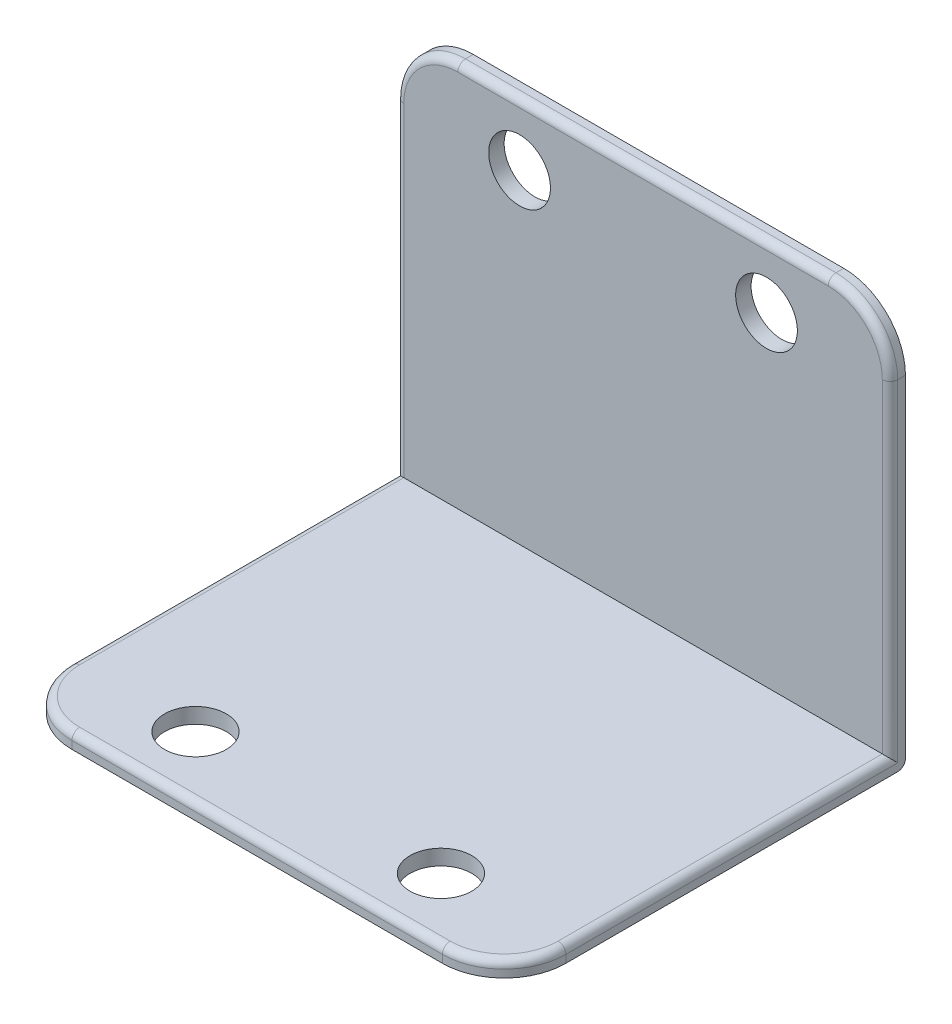
ISO-10303-21;
HEADER;
FILE_DESCRIPTION(('STEP AP214'),'2;1');
FILE_NAME('part.step','',(''),(''),'','','');
FILE_SCHEMA(('AUTOMOTIVE_DESIGN { 1 0 10303 214 1 1 1 1 }'));
ENDSEC;
DATA;
#1=APPLICATION_CONTEXT('core data for automotive mechanical design processes');
#2=APPLICATION_PROTOCOL_DEFINITION('international standard','automotive_design',2000,#1);
#3=PRODUCT_CONTEXT('',#1,'mechanical');
#4=PRODUCT('Part','Part','',(#3));
#5=PRODUCT_RELATED_PRODUCT_CATEGORY('part','',(#4));
#6=PRODUCT_DEFINITION_FORMATION('','',#4);
#7=PRODUCT_DEFINITION_CONTEXT('part definition',#1,'design');
#8=PRODUCT_DEFINITION('design','',#6,#7);
#9=PRODUCT_DEFINITION_SHAPE('','',#8);
#10=(LENGTH_UNIT() NAMED_UNIT(*) SI_UNIT(.MILLI.,.METRE.));
#11=(NAMED_UNIT(*) PLANE_ANGLE_UNIT() SI_UNIT($,.RADIAN.));
#12=(NAMED_UNIT(*) SI_UNIT($,.STERADIAN.) SOLID_ANGLE_UNIT());
#13=UNCERTAINTY_MEASURE_WITH_UNIT(LENGTH_MEASURE(1.E-05),#10,'distance_accuracy_value','');
#14=(GEOMETRIC_REPRESENTATION_CONTEXT(3) GLOBAL_UNCERTAINTY_ASSIGNED_CONTEXT((#13)) GLOBAL_UNIT_ASSIGNED_CONTEXT((#10,
#11,#12)) REPRESENTATION_CONTEXT('',''));
#15=CARTESIAN_POINT('',(0.,0.,0.));
#16=DIRECTION('',(0.,0.,1.));
#17=DIRECTION('',(1.,0.,0.));
#18=AXIS2_PLACEMENT_3D('',#15,#16,#17);
#19=CARTESIAN_POINT('',(0.,1.,0.));
#20=DIRECTION('',(0.,-1.,0.));
#21=DIRECTION('',(0.,0.,-1.));
#22=AXIS2_PLACEMENT_3D('',#19,#20,#21);
#23=PLANE('',#22);
#24=CARTESIAN_POINT('',(7.90530336490949,1.,9.));
#25=DIRECTION('',(0.,1.,0.));
#26=DIRECTION('',(0.,0.,1.));
#27=AXIS2_PLACEMENT_3D('',#24,#25,#26);
#28=CIRCLE('',#27,2.);
#29=CARTESIAN_POINT('',(7.90530336490949,1.,11.));
#30=VERTEX_POINT('',#29);
#31=EDGE_CURVE('E418',#30,#30,#28,.T.);
#32=ORIENTED_EDGE('',*,*,#31,.F.);
#33=EDGE_LOOP('',(#32));
#34=FACE_BOUND('',#33,.T.);
#35=CARTESIAN_POINT('',(-8.,1.,9.));
#36=DIRECTION('',(0.,1.,0.));
#37=DIRECTION('',(0.,0.,1.));
#38=AXIS2_PLACEMENT_3D('',#35,#36,#37);
#39=CIRCLE('',#38,2.);
#40=CARTESIAN_POINT('',(-8.,1.,11.));
#41=VERTEX_POINT('',#40);
#42=EDGE_CURVE('E427',#41,#41,#39,.T.);
#43=ORIENTED_EDGE('',*,*,#42,.F.);
#44=EDGE_LOOP('',(#43));
#45=FACE_BOUND('',#44,.T.);
#46=CARTESIAN_POINT('',(12.,1.,9.));
#47=DIRECTION('',(0.,-1.,0.));
#48=DIRECTION('',(0.,0.,-1.));
#49=AXIS2_PLACEMENT_3D('',#46,#47,#48);
#50=CIRCLE('',#49,3.5);
#51=CARTESIAN_POINT('',(12.,1.,12.5));
#52=VERTEX_POINT('',#51);
#53=CARTESIAN_POINT('',(15.5,1.,9.));
#54=VERTEX_POINT('',#53);
#55=EDGE_CURVE('E285',#52,#54,#50,.F.);
#56=ORIENTED_EDGE('',*,*,#55,.T.);
#57=DIRECTION('',(0.,0.,-1.));
#58=VECTOR('',#57,1.);
#59=CARTESIAN_POINT('',(15.5,1.,0.));
#60=LINE('',#59,#58);
#61=CARTESIAN_POINT('',(15.5,1.,-12.));
#62=VERTEX_POINT('',#61);
#63=EDGE_CURVE('E288',#54,#62,#60,.T.);
#64=ORIENTED_EDGE('',*,*,#63,.T.);
#65=DIRECTION('',(1.,0.,0.));
#66=VECTOR('',#65,1.);
#67=CARTESIAN_POINT('',(-16.,1.,-12.));
#68=LINE('',#67,#66);
#69=CARTESIAN_POINT('',(-15.5,1.,-12.));
#70=VERTEX_POINT('',#69);
#71=EDGE_CURVE('E362',#70,#62,#68,.T.);
#72=ORIENTED_EDGE('',*,*,#71,.F.);
#73=DIRECTION('',(0.,0.,1.));
#74=VECTOR('',#73,1.);
#75=CARTESIAN_POINT('',(-15.5,1.,0.));
#76=LINE('',#75,#74);
#77=CARTESIAN_POINT('',(-15.5,1.,9.));
#78=VERTEX_POINT('',#77);
#79=EDGE_CURVE('E258',#70,#78,#76,.T.);
#80=ORIENTED_EDGE('',*,*,#79,.T.);
#81=CARTESIAN_POINT('',(-12.,1.,9.));
#82=DIRECTION('',(0.,-1.,0.));
#83=DIRECTION('',(0.,0.,-1.));
#84=AXIS2_PLACEMENT_3D('',#81,#82,#83);
#85=CIRCLE('',#84,3.5);
#86=CARTESIAN_POINT('',(-12.,1.,12.5));
#87=VERTEX_POINT('',#86);
#88=EDGE_CURVE('E279',#78,#87,#85,.F.);
#89=ORIENTED_EDGE('',*,*,#88,.T.);
#90=DIRECTION('',(1.,0.,0.));
#91=VECTOR('',#90,1.);
#92=CARTESIAN_POINT('',(0.,1.,12.5));
#93=LINE('',#92,#91);
#94=EDGE_CURVE('E282',#87,#52,#93,.T.);
#95=ORIENTED_EDGE('',*,*,#94,.T.);
#96=EDGE_LOOP('',(#56,#64,#72,#80,#89,#95));
#97=FACE_BOUND('',#96,.T.);
#98=ADVANCED_FACE('F44',(#34,#45,#97),#23,.F.);
#99=CARTESIAN_POINT('',(0.,0.,0.));
#100=DIRECTION('',(0.,-1.,0.));
#101=DIRECTION('',(0.,0.,-1.));
#102=AXIS2_PLACEMENT_3D('',#99,#100,#101);
#103=PLANE('',#102);
#104=CARTESIAN_POINT('',(-8.,0.,9.));
#105=DIRECTION('',(0.,1.,0.));
#106=DIRECTION('',(0.,0.,1.));
#107=AXIS2_PLACEMENT_3D('',#104,#105,#106);
#108=CIRCLE('',#107,2.);
#109=CARTESIAN_POINT('',(-8.,0.,11.));
#110=VERTEX_POINT('',#109);
#111=EDGE_CURVE('E425',#110,#110,#108,.T.);
#112=ORIENTED_EDGE('',*,*,#111,.T.);
#113=EDGE_LOOP('',(#112));
#114=FACE_BOUND('',#113,.T.);
#115=DIRECTION('',(0.,0.,1.));
#116=VECTOR('',#115,1.);
#117=CARTESIAN_POINT('',(-16.,0.,13.));
#118=LINE('',#117,#116);
#119=CARTESIAN_POINT('',(-16.,0.,-12.5));
#120=VERTEX_POINT('',#119);
#121=CARTESIAN_POINT('',(-16.,0.,9.));
#122=VERTEX_POINT('',#121);
#123=EDGE_CURVE('E185',#120,#122,#118,.T.);
#124=ORIENTED_EDGE('',*,*,#123,.F.);
#125=DIRECTION('',(-1.,0.,0.));
#126=VECTOR('',#125,1.);
#127=CARTESIAN_POINT('',(16.,0.,-12.5));
#128=LINE('',#127,#126);
#129=CARTESIAN_POINT('',(16.,0.,-12.5));
#130=VERTEX_POINT('',#129);
#131=EDGE_CURVE('E53',#120,#130,#128,.F.);
#132=ORIENTED_EDGE('',*,*,#131,.T.);
#133=DIRECTION('',(0.,0.,-1.));
#134=VECTOR('',#133,1.);
#135=CARTESIAN_POINT('',(16.,0.,13.));
#136=LINE('',#135,#134);
#137=CARTESIAN_POINT('',(16.,0.,9.));
#138=VERTEX_POINT('',#137);
#139=EDGE_CURVE('E190',#138,#130,#136,.T.);
#140=ORIENTED_EDGE('',*,*,#139,.F.);
#141=CARTESIAN_POINT('',(12.,0.,9.));
#142=DIRECTION('',(0.,-1.,0.));
#143=DIRECTION('',(0.,0.,-1.));
#144=AXIS2_PLACEMENT_3D('',#141,#142,#143);
#145=CIRCLE('',#144,4.);
#146=CARTESIAN_POINT('',(12.,0.,13.));
#147=VERTEX_POINT('',#146);
#148=EDGE_CURVE('E182',#138,#147,#145,.T.);
#149=ORIENTED_EDGE('',*,*,#148,.T.);
#150=DIRECTION('',(1.,0.,0.));
#151=VECTOR('',#150,1.);
#152=CARTESIAN_POINT('',(-16.,0.,13.));
#153=LINE('',#152,#151);
#154=CARTESIAN_POINT('',(-12.,0.,13.));
#155=VERTEX_POINT('',#154);
#156=EDGE_CURVE('E162',#155,#147,#153,.T.);
#157=ORIENTED_EDGE('',*,*,#156,.F.);
#158=CARTESIAN_POINT('',(-12.,0.,9.));
#159=DIRECTION('',(0.,-1.,0.));
#160=DIRECTION('',(0.,0.,-1.));
#161=AXIS2_PLACEMENT_3D('',#158,#159,#160);
#162=CIRCLE('',#161,4.);
#163=EDGE_CURVE('E169',#155,#122,#162,.T.);
#164=ORIENTED_EDGE('',*,*,#163,.T.);
#165=EDGE_LOOP('',(#124,#132,#140,#149,#157,#164));
#166=FACE_BOUND('',#165,.T.);
#167=CARTESIAN_POINT('',(7.90530336490949,0.,9.));
#168=DIRECTION('',(0.,1.,0.));
#169=DIRECTION('',(0.,0.,1.));
#170=AXIS2_PLACEMENT_3D('',#167,#168,#169);
#171=CIRCLE('',#170,2.);
#172=CARTESIAN_POINT('',(7.90530336490949,0.,11.));
#173=VERTEX_POINT('',#172);
#174=EDGE_CURVE('E414',#173,#173,#171,.T.);
#175=ORIENTED_EDGE('',*,*,#174,.T.);
#176=EDGE_LOOP('',(#175));
#177=FACE_BOUND('',#176,.T.);
#178=ADVANCED_FACE('F179',(#114,#166,#177),#103,.T.);
#179=CARTESIAN_POINT('',(16.,1.,13.));
#180=DIRECTION('',(-1.,0.,0.));
#181=DIRECTION('',(0.,0.,1.));
#182=AXIS2_PLACEMENT_3D('',#179,#180,#181);
#183=PLANE('',#182);
#184=ORIENTED_EDGE('',*,*,#139,.T.);
#185=CARTESIAN_POINT('',(16.,0.5,-12.5));
#186=DIRECTION('',(-1.,0.,0.));
#187=DIRECTION('',(0.,0.,1.));
#188=AXIS2_PLACEMENT_3D('',#185,#186,#187);
#189=CIRCLE('',#188,0.5);
#190=CARTESIAN_POINT('',(16.,0.5,-13.));
#191=VERTEX_POINT('',#190);
#192=EDGE_CURVE('E11',#130,#191,#189,.F.);
#193=ORIENTED_EDGE('',*,*,#192,.T.);
#194=DIRECTION('',(0.,-1.,0.));
#195=VECTOR('',#194,1.);
#196=CARTESIAN_POINT('',(16.,1.,-13.));
#197=LINE('',#196,#195);
#198=CARTESIAN_POINT('',(16.,22.,-13.));
#199=VERTEX_POINT('',#198);
#200=EDGE_CURVE('E170',#199,#191,#197,.T.);
#201=ORIENTED_EDGE('',*,*,#200,.F.);
#202=DIRECTION('',(0.,0.,-1.));
#203=VECTOR('',#202,1.);
#204=CARTESIAN_POINT('',(16.,22.,-12.));
#205=LINE('',#204,#203);
#206=CARTESIAN_POINT('',(16.,22.,-12.5));
#207=VERTEX_POINT('',#206);
#208=EDGE_CURVE('E213',#199,#207,#205,.F.);
#209=ORIENTED_EDGE('',*,*,#208,.T.);
#210=DIRECTION('',(0.,-1.,0.));
#211=VECTOR('',#210,1.);
#212=CARTESIAN_POINT('',(16.,1.,-12.5));
#213=LINE('',#212,#211);
#214=CARTESIAN_POINT('',(16.,0.5,-12.5));
#215=VERTEX_POINT('',#214);
#216=EDGE_CURVE('E255',#207,#215,#213,.T.);
#217=ORIENTED_EDGE('',*,*,#216,.T.);
#218=DIRECTION('',(0.,0.,-1.));
#219=VECTOR('',#218,1.);
#220=CARTESIAN_POINT('',(16.,0.5,13.));
#221=LINE('',#220,#219);
#222=CARTESIAN_POINT('',(16.,0.5,9.));
#223=VERTEX_POINT('',#222);
#224=EDGE_CURVE('E292',#215,#223,#221,.F.);
#225=ORIENTED_EDGE('',*,*,#224,.T.);
#226=DIRECTION('',(0.,-1.,0.));
#227=VECTOR('',#226,1.);
#228=CARTESIAN_POINT('',(16.,1.,9.));
#229=LINE('',#228,#227);
#230=EDGE_CURVE('E199',#223,#138,#229,.T.);
#231=ORIENTED_EDGE('',*,*,#230,.T.);
#232=EDGE_LOOP('',(#184,#193,#201,#209,#217,#225,#231));
#233=FACE_BOUND('',#232,.T.);
#234=ADVANCED_FACE('F435',(#233),#183,.F.);
#235=CARTESIAN_POINT('',(-16.,1.,-13.));
#236=DIRECTION('',(0.,0.,1.));
#237=DIRECTION('',(1.,0.,0.));
#238=AXIS2_PLACEMENT_3D('',#235,#236,#237);
#239=PLANE('',#238);
#240=CARTESIAN_POINT('',(8.,22.,-13.));
#241=DIRECTION('',(0.,0.,1.));
#242=DIRECTION('',(1.,0.,0.));
#243=AXIS2_PLACEMENT_3D('',#240,#241,#242);
#244=CIRCLE('',#243,2.);
#245=CARTESIAN_POINT('',(10.,22.,-13.));
#246=VERTEX_POINT('',#245);
#247=EDGE_CURVE('E370',#246,#246,#244,.T.);
#248=ORIENTED_EDGE('',*,*,#247,.T.);
#249=EDGE_LOOP('',(#248));
#250=FACE_BOUND('',#249,.T.);
#251=CARTESIAN_POINT('',(-8.,22.,-13.));
#252=DIRECTION('',(0.,0.,1.));
#253=DIRECTION('',(1.,0.,0.));
#254=AXIS2_PLACEMENT_3D('',#251,#252,#253);
#255=CIRCLE('',#254,2.);
#256=CARTESIAN_POINT('',(-6.,22.,-13.));
#257=VERTEX_POINT('',#256);
#258=EDGE_CURVE('E276',#257,#257,#255,.T.);
#259=ORIENTED_EDGE('',*,*,#258,.T.);
#260=EDGE_LOOP('',(#259));
#261=FACE_BOUND('',#260,.T.);
#262=ORIENTED_EDGE('',*,*,#200,.T.);
#263=DIRECTION('',(-1.,0.,0.));
#264=VECTOR('',#263,1.);
#265=CARTESIAN_POINT('',(-16.,0.5,-13.));
#266=LINE('',#265,#264);
#267=CARTESIAN_POINT('',(-16.,0.5,-13.));
#268=VERTEX_POINT('',#267);
#269=EDGE_CURVE('E314',#191,#268,#266,.T.);
#270=ORIENTED_EDGE('',*,*,#269,.T.);
#271=DIRECTION('',(0.,-1.,0.));
#272=VECTOR('',#271,1.);
#273=CARTESIAN_POINT('',(-16.,1.,-13.));
#274=LINE('',#273,#272);
#275=CARTESIAN_POINT('',(-16.,22.,-13.));
#276=VERTEX_POINT('',#275);
#277=EDGE_CURVE('E184',#276,#268,#274,.T.);
#278=ORIENTED_EDGE('',*,*,#277,.F.);
#279=CARTESIAN_POINT('',(-12.,22.,-13.));
#280=DIRECTION('',(0.,0.,1.));
#281=DIRECTION('',(1.,0.,0.));
#282=AXIS2_PLACEMENT_3D('',#279,#280,#281);
#283=CIRCLE('',#282,4.);
#284=CARTESIAN_POINT('',(-12.,26.,-13.));
#285=VERTEX_POINT('',#284);
#286=EDGE_CURVE('E224',#276,#285,#283,.F.);
#287=ORIENTED_EDGE('',*,*,#286,.T.);
#288=DIRECTION('',(-1.,0.,0.));
#289=VECTOR('',#288,1.);
#290=CARTESIAN_POINT('',(-16.,26.,-13.));
#291=LINE('',#290,#289);
#292=CARTESIAN_POINT('',(12.,26.,-13.));
#293=VERTEX_POINT('',#292);
#294=EDGE_CURVE('E369',#293,#285,#291,.T.);
#295=ORIENTED_EDGE('',*,*,#294,.F.);
#296=CARTESIAN_POINT('',(12.,22.,-13.));
#297=DIRECTION('',(0.,0.,1.));
#298=DIRECTION('',(1.,0.,0.));
#299=AXIS2_PLACEMENT_3D('',#296,#297,#298);
#300=CIRCLE('',#299,4.);
#301=EDGE_CURVE('E210',#293,#199,#300,.F.);
#302=ORIENTED_EDGE('',*,*,#301,.T.);
#303=EDGE_LOOP('',(#262,#270,#278,#287,#295,#302));
#304=FACE_BOUND('',#303,.T.);
#305=ADVANCED_FACE('F338',(#250,#261,#304),#239,.F.);
#306=CARTESIAN_POINT('',(-16.,1.,13.));
#307=DIRECTION('',(1.,0.,0.));
#308=DIRECTION('',(0.,0.,-1.));
#309=AXIS2_PLACEMENT_3D('',#306,#307,#308);
#310=PLANE('',#309);
#311=ORIENTED_EDGE('',*,*,#277,.T.);
#312=CARTESIAN_POINT('',(-16.,0.5,-12.5));
#313=DIRECTION('',(1.,0.,0.));
#314=DIRECTION('',(0.,0.,-1.));
#315=AXIS2_PLACEMENT_3D('',#312,#313,#314);
#316=CIRCLE('',#315,0.5);
#317=EDGE_CURVE('E67',#268,#120,#316,.F.);
#318=ORIENTED_EDGE('',*,*,#317,.T.);
#319=ORIENTED_EDGE('',*,*,#123,.T.);
#320=DIRECTION('',(0.,-1.,0.));
#321=VECTOR('',#320,1.);
#322=CARTESIAN_POINT('',(-16.,1.,9.));
#323=LINE('',#322,#321);
#324=CARTESIAN_POINT('',(-16.,0.5,9.));
#325=VERTEX_POINT('',#324);
#326=EDGE_CURVE('E176',#122,#325,#323,.F.);
#327=ORIENTED_EDGE('',*,*,#326,.T.);
#328=DIRECTION('',(0.,0.,1.));
#329=VECTOR('',#328,1.);
#330=CARTESIAN_POINT('',(-16.,0.5,13.));
#331=LINE('',#330,#329);
#332=CARTESIAN_POINT('',(-16.,0.5,-12.5));
#333=VERTEX_POINT('',#332);
#334=EDGE_CURVE('E303',#325,#333,#331,.F.);
#335=ORIENTED_EDGE('',*,*,#334,.T.);
#336=DIRECTION('',(0.,-1.,0.));
#337=VECTOR('',#336,1.);
#338=CARTESIAN_POINT('',(-16.,1.,-12.5));
#339=LINE('',#338,#337);
#340=CARTESIAN_POINT('',(-16.,22.,-12.5));
#341=VERTEX_POINT('',#340);
#342=EDGE_CURVE('E243',#333,#341,#339,.F.);
#343=ORIENTED_EDGE('',*,*,#342,.T.);
#344=DIRECTION('',(0.,0.,1.));
#345=VECTOR('',#344,1.);
#346=CARTESIAN_POINT('',(-16.,22.,-13.));
#347=LINE('',#346,#345);
#348=EDGE_CURVE('E221',#341,#276,#347,.F.);
#349=ORIENTED_EDGE('',*,*,#348,.T.);
#350=EDGE_LOOP('',(#311,#318,#319,#327,#335,#343,#349));
#351=FACE_BOUND('',#350,.T.);
#352=ADVANCED_FACE('F343',(#351),#310,.F.);
#353=CARTESIAN_POINT('',(-16.,1.,13.));
#354=DIRECTION('',(0.,0.,-1.));
#355=DIRECTION('',(-1.,0.,0.));
#356=AXIS2_PLACEMENT_3D('',#353,#354,#355);
#357=PLANE('',#356);
#358=DIRECTION('',(0.,-1.,0.));
#359=VECTOR('',#358,1.);
#360=CARTESIAN_POINT('',(12.,1.,13.));
#361=LINE('',#360,#359);
#362=CARTESIAN_POINT('',(12.,0.5,13.));
#363=VERTEX_POINT('',#362);
#364=EDGE_CURVE('E204',#147,#363,#361,.F.);
#365=ORIENTED_EDGE('',*,*,#364,.T.);
#366=DIRECTION('',(1.,0.,0.));
#367=VECTOR('',#366,1.);
#368=CARTESIAN_POINT('',(-16.,0.5,13.));
#369=LINE('',#368,#367);
#370=CARTESIAN_POINT('',(-12.,0.5,13.));
#371=VERTEX_POINT('',#370);
#372=EDGE_CURVE('E165',#363,#371,#369,.F.);
#373=ORIENTED_EDGE('',*,*,#372,.T.);
#374=DIRECTION('',(0.,-1.,0.));
#375=VECTOR('',#374,1.);
#376=CARTESIAN_POINT('',(-12.,1.,13.));
#377=LINE('',#376,#375);
#378=EDGE_CURVE('E157',#371,#155,#377,.T.);
#379=ORIENTED_EDGE('',*,*,#378,.T.);
#380=ORIENTED_EDGE('',*,*,#156,.T.);
#381=EDGE_LOOP('',(#365,#373,#379,#380));
#382=FACE_BOUND('',#381,.T.);
#383=ADVANCED_FACE('F160',(#382),#357,.F.);
#384=CARTESIAN_POINT('',(-8.,1.,9.));
#385=DIRECTION('',(0.,-1.,0.));
#386=DIRECTION('',(0.,0.,-1.));
#387=AXIS2_PLACEMENT_3D('',#384,#385,#386);
#388=CYLINDRICAL_SURFACE('',#387,2.);
#389=ORIENTED_EDGE('',*,*,#42,.T.);
#390=EDGE_LOOP('',(#389));
#391=FACE_BOUND('',#390,.T.);
#392=ORIENTED_EDGE('',*,*,#111,.F.);
#393=EDGE_LOOP('',(#392));
#394=FACE_BOUND('',#393,.T.);
#395=ADVANCED_FACE('F456',(#391,#394),#388,.F.);
#396=CARTESIAN_POINT('',(7.90530336490949,1.,9.));
#397=DIRECTION('',(0.,-1.,0.));
#398=DIRECTION('',(0.,0.,-1.));
#399=AXIS2_PLACEMENT_3D('',#396,#397,#398);
#400=CYLINDRICAL_SURFACE('',#399,2.);
#401=ORIENTED_EDGE('',*,*,#31,.T.);
#402=EDGE_LOOP('',(#401));
#403=FACE_BOUND('',#402,.T.);
#404=ORIENTED_EDGE('',*,*,#174,.F.);
#405=EDGE_LOOP('',(#404));
#406=FACE_BOUND('',#405,.T.);
#407=ADVANCED_FACE('F469',(#403,#406),#400,.F.);
#408=CARTESIAN_POINT('',(-12.,1.,9.));
#409=DIRECTION('',(0.,-1.,0.));
#410=DIRECTION('',(0.,0.,-1.));
#411=AXIS2_PLACEMENT_3D('',#408,#409,#410);
#412=CYLINDRICAL_SURFACE('',#411,4.);
#413=ORIENTED_EDGE('',*,*,#378,.F.);
#414=CARTESIAN_POINT('',(-12.,0.5,9.));
#415=DIRECTION('',(0.,-1.,0.));
#416=DIRECTION('',(0.,0.,-1.));
#417=AXIS2_PLACEMENT_3D('',#414,#415,#416);
#418=CIRCLE('',#417,4.);
#419=EDGE_CURVE('E300',#371,#325,#418,.T.);
#420=ORIENTED_EDGE('',*,*,#419,.T.);
#421=ORIENTED_EDGE('',*,*,#326,.F.);
#422=ORIENTED_EDGE('',*,*,#163,.F.);
#423=EDGE_LOOP('',(#413,#420,#421,#422));
#424=FACE_BOUND('',#423,.T.);
#425=ADVANCED_FACE('F174',(#424),#412,.T.);
#426=CARTESIAN_POINT('',(12.,1.,9.));
#427=DIRECTION('',(0.,-1.,0.));
#428=DIRECTION('',(0.,0.,-1.));
#429=AXIS2_PLACEMENT_3D('',#426,#427,#428);
#430=CYLINDRICAL_SURFACE('',#429,4.);
#431=ORIENTED_EDGE('',*,*,#230,.F.);
#432=CARTESIAN_POINT('',(12.,0.5,9.));
#433=DIRECTION('',(0.,-1.,0.));
#434=DIRECTION('',(0.,0.,-1.));
#435=AXIS2_PLACEMENT_3D('',#432,#433,#434);
#436=CIRCLE('',#435,4.);
#437=EDGE_CURVE('E295',#223,#363,#436,.T.);
#438=ORIENTED_EDGE('',*,*,#437,.T.);
#439=ORIENTED_EDGE('',*,*,#364,.F.);
#440=ORIENTED_EDGE('',*,*,#148,.F.);
#441=EDGE_LOOP('',(#431,#438,#439,#440));
#442=FACE_BOUND('',#441,.T.);
#443=ADVANCED_FACE('F468',(#442),#430,.T.);
#444=CARTESIAN_POINT('',(-16.,26.,-12.));
#445=DIRECTION('',(0.,0.,-1.));
#446=DIRECTION('',(-1.,0.,0.));
#447=AXIS2_PLACEMENT_3D('',#444,#445,#446);
#448=PLANE('',#447);
#449=CARTESIAN_POINT('',(8.,22.,-12.));
#450=DIRECTION('',(0.,0.,1.));
#451=DIRECTION('',(1.,0.,0.));
#452=AXIS2_PLACEMENT_3D('',#449,#450,#451);
#453=CIRCLE('',#452,2.);
#454=CARTESIAN_POINT('',(10.,22.,-12.));
#455=VERTEX_POINT('',#454);
#456=EDGE_CURVE('E686',#455,#455,#453,.T.);
#457=ORIENTED_EDGE('',*,*,#456,.F.);
#458=EDGE_LOOP('',(#457));
#459=FACE_BOUND('',#458,.T.);
#460=CARTESIAN_POINT('',(-8.,22.,-12.));
#461=DIRECTION('',(0.,0.,1.));
#462=DIRECTION('',(1.,0.,0.));
#463=AXIS2_PLACEMENT_3D('',#460,#461,#462);
#464=CIRCLE('',#463,2.);
#465=CARTESIAN_POINT('',(-6.,22.,-12.));
#466=VERTEX_POINT('',#465);
#467=EDGE_CURVE('E688',#466,#466,#464,.T.);
#468=ORIENTED_EDGE('',*,*,#467,.F.);
#469=EDGE_LOOP('',(#468));
#470=FACE_BOUND('',#469,.T.);
#471=CARTESIAN_POINT('',(-12.,22.,-12.));
#472=DIRECTION('',(0.,0.,-1.));
#473=DIRECTION('',(-1.,0.,0.));
#474=AXIS2_PLACEMENT_3D('',#471,#472,#473);
#475=CIRCLE('',#474,3.5);
#476=CARTESIAN_POINT('',(-12.,25.5,-12.));
#477=VERTEX_POINT('',#476);
#478=CARTESIAN_POINT('',(-15.5,22.,-12.));
#479=VERTEX_POINT('',#478);
#480=EDGE_CURVE('E236',#477,#479,#475,.F.);
#481=ORIENTED_EDGE('',*,*,#480,.T.);
#482=DIRECTION('',(0.,-1.,0.));
#483=VECTOR('',#482,1.);
#484=CARTESIAN_POINT('',(-15.5,26.,-12.));
#485=LINE('',#484,#483);
#486=EDGE_CURVE('E239',#479,#70,#485,.T.);
#487=ORIENTED_EDGE('',*,*,#486,.T.);
#488=ORIENTED_EDGE('',*,*,#71,.T.);
#489=DIRECTION('',(0.,-1.,0.));
#490=VECTOR('',#489,1.);
#491=CARTESIAN_POINT('',(15.5,26.,-12.));
#492=LINE('',#491,#490);
#493=CARTESIAN_POINT('',(15.5,22.,-12.));
#494=VERTEX_POINT('',#493);
#495=EDGE_CURVE('E227',#62,#494,#492,.F.);
#496=ORIENTED_EDGE('',*,*,#495,.T.);
#497=CARTESIAN_POINT('',(12.,22.,-12.));
#498=DIRECTION('',(0.,0.,-1.));
#499=DIRECTION('',(-1.,0.,0.));
#500=AXIS2_PLACEMENT_3D('',#497,#498,#499);
#501=CIRCLE('',#500,3.5);
#502=CARTESIAN_POINT('',(12.,25.5,-12.));
#503=VERTEX_POINT('',#502);
#504=EDGE_CURVE('E230',#494,#503,#501,.F.);
#505=ORIENTED_EDGE('',*,*,#504,.T.);
#506=DIRECTION('',(1.,0.,0.));
#507=VECTOR('',#506,1.);
#508=CARTESIAN_POINT('',(-12.,25.5,-12.));
#509=LINE('',#508,#507);
#510=EDGE_CURVE('E233',#503,#477,#509,.F.);
#511=ORIENTED_EDGE('',*,*,#510,.T.);
#512=EDGE_LOOP('',(#481,#487,#488,#496,#505,#511));
#513=FACE_BOUND('',#512,.T.);
#514=ADVANCED_FACE('F361',(#459,#470,#513),#448,.F.);
#515=CARTESIAN_POINT('',(0.,26.,0.));
#516=DIRECTION('',(0.,1.,0.));
#517=DIRECTION('',(0.,0.,1.));
#518=AXIS2_PLACEMENT_3D('',#515,#516,#517);
#519=PLANE('',#518);
#520=DIRECTION('',(0.,0.,1.));
#521=VECTOR('',#520,1.);
#522=CARTESIAN_POINT('',(-12.,26.,-12.));
#523=LINE('',#522,#521);
#524=CARTESIAN_POINT('',(-12.,26.,-12.5));
#525=VERTEX_POINT('',#524);
#526=EDGE_CURVE('E217',#285,#525,#523,.T.);
#527=ORIENTED_EDGE('',*,*,#526,.T.);
#528=DIRECTION('',(1.,0.,0.));
#529=VECTOR('',#528,1.);
#530=CARTESIAN_POINT('',(12.,26.,-12.5));
#531=LINE('',#530,#529);
#532=CARTESIAN_POINT('',(12.,26.,-12.5));
#533=VERTEX_POINT('',#532);
#534=EDGE_CURVE('E249',#525,#533,#531,.T.);
#535=ORIENTED_EDGE('',*,*,#534,.T.);
#536=DIRECTION('',(0.,0.,-1.));
#537=VECTOR('',#536,1.);
#538=CARTESIAN_POINT('',(12.,26.,-13.));
#539=LINE('',#538,#537);
#540=EDGE_CURVE('E207',#533,#293,#539,.T.);
#541=ORIENTED_EDGE('',*,*,#540,.T.);
#542=ORIENTED_EDGE('',*,*,#294,.T.);
#543=EDGE_LOOP('',(#527,#535,#541,#542));
#544=FACE_BOUND('',#543,.T.);
#545=ADVANCED_FACE('F406',(#544),#519,.T.);
#546=CARTESIAN_POINT('',(12.,22.,0.));
#547=DIRECTION('',(0.,0.,1.));
#548=DIRECTION('',(1.,0.,0.));
#549=AXIS2_PLACEMENT_3D('',#546,#547,#548);
#550=CYLINDRICAL_SURFACE('',#549,4.);
#551=ORIENTED_EDGE('',*,*,#540,.F.);
#552=CARTESIAN_POINT('',(12.,22.,-12.5));
#553=DIRECTION('',(0.,0.,-1.));
#554=DIRECTION('',(-1.,0.,0.));
#555=AXIS2_PLACEMENT_3D('',#552,#553,#554);
#556=CIRCLE('',#555,4.);
#557=EDGE_CURVE('E252',#533,#207,#556,.T.);
#558=ORIENTED_EDGE('',*,*,#557,.T.);
#559=ORIENTED_EDGE('',*,*,#208,.F.);
#560=ORIENTED_EDGE('',*,*,#301,.F.);
#561=EDGE_LOOP('',(#551,#558,#559,#560));
#562=FACE_BOUND('',#561,.T.);
#563=ADVANCED_FACE('F410',(#562),#550,.T.);
#564=CARTESIAN_POINT('',(-12.,22.,0.));
#565=DIRECTION('',(0.,0.,-1.));
#566=DIRECTION('',(-1.,0.,0.));
#567=AXIS2_PLACEMENT_3D('',#564,#565,#566);
#568=CYLINDRICAL_SURFACE('',#567,4.);
#569=ORIENTED_EDGE('',*,*,#348,.F.);
#570=CARTESIAN_POINT('',(-12.,22.,-12.5));
#571=DIRECTION('',(0.,0.,-1.));
#572=DIRECTION('',(-1.,0.,0.));
#573=AXIS2_PLACEMENT_3D('',#570,#571,#572);
#574=CIRCLE('',#573,4.);
#575=EDGE_CURVE('E246',#341,#525,#574,.T.);
#576=ORIENTED_EDGE('',*,*,#575,.T.);
#577=ORIENTED_EDGE('',*,*,#526,.F.);
#578=ORIENTED_EDGE('',*,*,#286,.F.);
#579=EDGE_LOOP('',(#569,#576,#577,#578));
#580=FACE_BOUND('',#579,.T.);
#581=ADVANCED_FACE('F347',(#580),#568,.T.);
#582=CARTESIAN_POINT('',(-8.,22.,-13.));
#583=DIRECTION('',(0.,0.,1.));
#584=DIRECTION('',(1.,0.,0.));
#585=AXIS2_PLACEMENT_3D('',#582,#583,#584);
#586=CYLINDRICAL_SURFACE('',#585,2.);
#587=ORIENTED_EDGE('',*,*,#258,.F.);
#588=EDGE_LOOP('',(#587));
#589=FACE_BOUND('',#588,.T.);
#590=ORIENTED_EDGE('',*,*,#467,.T.);
#591=EDGE_LOOP('',(#590));
#592=FACE_BOUND('',#591,.T.);
#593=ADVANCED_FACE('F477',(#589,#592),#586,.F.);
#594=CARTESIAN_POINT('',(8.,22.,-13.));
#595=DIRECTION('',(0.,0.,1.));
#596=DIRECTION('',(1.,0.,0.));
#597=AXIS2_PLACEMENT_3D('',#594,#595,#596);
#598=CYLINDRICAL_SURFACE('',#597,2.);
#599=ORIENTED_EDGE('',*,*,#247,.F.);
#600=EDGE_LOOP('',(#599));
#601=FACE_BOUND('',#600,.T.);
#602=ORIENTED_EDGE('',*,*,#456,.T.);
#603=EDGE_LOOP('',(#602));
#604=FACE_BOUND('',#603,.T.);
#605=ADVANCED_FACE('F486',(#601,#604),#598,.F.);
#606=CARTESIAN_POINT('',(15.5,1.,-12.5));
#607=DIRECTION('',(0.,-1.,0.));
#608=DIRECTION('',(0.,0.,-1.));
#609=AXIS2_PLACEMENT_3D('',#606,#607,#608);
#610=CYLINDRICAL_SURFACE('',#609,0.5);
#611=ORIENTED_EDGE('',*,*,#495,.F.);
#612=CARTESIAN_POINT('',(15.5,0.5,-12.5));
#613=DIRECTION('',(0.,0.707106781186547,-0.707106781186547));
#614=DIRECTION('',(0.,-0.707106781186547,-0.707106781186547));
#615=AXIS2_PLACEMENT_3D('',#612,#613,#614);
#616=ELLIPSE('',#615,0.707106781186547,0.5);
#617=EDGE_CURVE('E307',#62,#215,#616,.T.);
#618=ORIENTED_EDGE('',*,*,#617,.T.);
#619=ORIENTED_EDGE('',*,*,#216,.F.);
#620=CARTESIAN_POINT('',(15.5,22.,-12.5));
#621=DIRECTION('',(0.,1.,0.));
#622=DIRECTION('',(0.,0.,1.));
#623=AXIS2_PLACEMENT_3D('',#620,#621,#622);
#624=CIRCLE('',#623,0.5);
#625=EDGE_CURVE('E272',#494,#207,#624,.T.);
#626=ORIENTED_EDGE('',*,*,#625,.F.);
#627=EDGE_LOOP('',(#611,#618,#619,#626));
#628=FACE_BOUND('',#627,.T.);
#629=ADVANCED_FACE('F393',(#628),#610,.T.);
#630=CARTESIAN_POINT('',(12.,22.,-12.5));
#631=DIRECTION('',(0.,0.,-1.));
#632=DIRECTION('',(-1.,0.,0.));
#633=AXIS2_PLACEMENT_3D('',#630,#631,#632);
#634=TOROIDAL_SURFACE('',#633,3.5,0.5);
#635=ORIENTED_EDGE('',*,*,#625,.T.);
#636=ORIENTED_EDGE('',*,*,#557,.F.);
#637=CARTESIAN_POINT('',(12.,25.5,-12.5));
#638=DIRECTION('',(-1.,0.,0.));
#639=DIRECTION('',(0.,0.,1.));
#640=AXIS2_PLACEMENT_3D('',#637,#638,#639);
#641=CIRCLE('',#640,0.5);
#642=EDGE_CURVE('E268',#503,#533,#641,.T.);
#643=ORIENTED_EDGE('',*,*,#642,.F.);
#644=ORIENTED_EDGE('',*,*,#504,.F.);
#645=EDGE_LOOP('',(#635,#636,#643,#644));
#646=FACE_BOUND('',#645,.T.);
#647=ADVANCED_FACE('F400',(#646),#634,.T.);
#648=CARTESIAN_POINT('',(0.,25.5,-12.5));
#649=DIRECTION('',(-1.,0.,0.));
#650=DIRECTION('',(0.,0.,1.));
#651=AXIS2_PLACEMENT_3D('',#648,#649,#650);
#652=CYLINDRICAL_SURFACE('',#651,0.5);
#653=ORIENTED_EDGE('',*,*,#642,.T.);
#654=ORIENTED_EDGE('',*,*,#534,.F.);
#655=CARTESIAN_POINT('',(-12.,25.5,-12.5));
#656=DIRECTION('',(-1.,0.,0.));
#657=DIRECTION('',(0.,0.,1.));
#658=AXIS2_PLACEMENT_3D('',#655,#656,#657);
#659=CIRCLE('',#658,0.5);
#660=EDGE_CURVE('E263',#477,#525,#659,.T.);
#661=ORIENTED_EDGE('',*,*,#660,.F.);
#662=ORIENTED_EDGE('',*,*,#510,.F.);
#663=EDGE_LOOP('',(#653,#654,#661,#662));
#664=FACE_BOUND('',#663,.T.);
#665=ADVANCED_FACE('F403',(#664),#652,.T.);
#666=CARTESIAN_POINT('',(-12.,22.,-12.5));
#667=DIRECTION('',(0.,0.,-1.));
#668=DIRECTION('',(-1.,0.,0.));
#669=AXIS2_PLACEMENT_3D('',#666,#667,#668);
#670=TOROIDAL_SURFACE('',#669,3.5,0.5);
#671=ORIENTED_EDGE('',*,*,#660,.T.);
#672=ORIENTED_EDGE('',*,*,#575,.F.);
#673=CARTESIAN_POINT('',(-15.5,22.,-12.5));
#674=DIRECTION('',(0.,-1.,0.));
#675=DIRECTION('',(0.,0.,-1.));
#676=AXIS2_PLACEMENT_3D('',#673,#674,#675);
#677=CIRCLE('',#676,0.5);
#678=EDGE_CURVE('E259',#479,#341,#677,.T.);
#679=ORIENTED_EDGE('',*,*,#678,.F.);
#680=ORIENTED_EDGE('',*,*,#480,.F.);
#681=EDGE_LOOP('',(#671,#672,#679,#680));
#682=FACE_BOUND('',#681,.T.);
#683=ADVANCED_FACE('F351',(#682),#670,.T.);
#684=CARTESIAN_POINT('',(-15.5,26.,-12.5));
#685=DIRECTION('',(0.,-1.,0.));
#686=DIRECTION('',(0.,0.,-1.));
#687=AXIS2_PLACEMENT_3D('',#684,#685,#686);
#688=CYLINDRICAL_SURFACE('',#687,0.5);
#689=ORIENTED_EDGE('',*,*,#678,.T.);
#690=ORIENTED_EDGE('',*,*,#342,.F.);
#691=CARTESIAN_POINT('',(-15.5,0.5,-12.5));
#692=DIRECTION('',(0.,-0.707106781186547,0.707106781186547));
#693=DIRECTION('',(0.,0.707106781186547,0.707106781186547));
#694=AXIS2_PLACEMENT_3D('',#691,#692,#693);
#695=ELLIPSE('',#694,0.707106781186547,0.5);
#696=EDGE_CURVE('E311',#333,#70,#695,.F.);
#697=ORIENTED_EDGE('',*,*,#696,.T.);
#698=ORIENTED_EDGE('',*,*,#486,.F.);
#699=EDGE_LOOP('',(#689,#690,#697,#698));
#700=FACE_BOUND('',#699,.T.);
#701=ADVANCED_FACE('F356',(#700),#688,.T.);
#702=CARTESIAN_POINT('',(-15.5,0.5,0.));
#703=DIRECTION('',(0.,0.,1.));
#704=DIRECTION('',(1.,0.,0.));
#705=AXIS2_PLACEMENT_3D('',#702,#703,#704);
#706=CYLINDRICAL_SURFACE('',#705,0.5);
#707=ORIENTED_EDGE('',*,*,#696,.F.);
#708=ORIENTED_EDGE('',*,*,#334,.F.);
#709=CARTESIAN_POINT('',(-15.5,0.5,9.));
#710=DIRECTION('',(0.,0.,1.));
#711=DIRECTION('',(1.,0.,0.));
#712=AXIS2_PLACEMENT_3D('',#709,#710,#711);
#713=CIRCLE('',#712,0.5);
#714=EDGE_CURVE('E264',#78,#325,#713,.T.);
#715=ORIENTED_EDGE('',*,*,#714,.F.);
#716=ORIENTED_EDGE('',*,*,#79,.F.);
#717=EDGE_LOOP('',(#707,#708,#715,#716));
#718=FACE_BOUND('',#717,.T.);
#719=ADVANCED_FACE('F373',(#718),#706,.T.);
#720=CARTESIAN_POINT('',(-12.,0.5,9.));
#721=DIRECTION('',(0.,-1.,0.));
#722=DIRECTION('',(0.,0.,-1.));
#723=AXIS2_PLACEMENT_3D('',#720,#721,#722);
#724=TOROIDAL_SURFACE('',#723,3.5,0.5);
#725=ORIENTED_EDGE('',*,*,#714,.T.);
#726=ORIENTED_EDGE('',*,*,#419,.F.);
#727=CARTESIAN_POINT('',(-12.,0.5,12.5));
#728=DIRECTION('',(1.,0.,0.));
#729=DIRECTION('',(0.,0.,-1.));
#730=AXIS2_PLACEMENT_3D('',#727,#728,#729);
#731=CIRCLE('',#730,0.5);
#732=EDGE_CURVE('E323',#87,#371,#731,.T.);
#733=ORIENTED_EDGE('',*,*,#732,.F.);
#734=ORIENTED_EDGE('',*,*,#88,.F.);
#735=EDGE_LOOP('',(#725,#726,#733,#734));
#736=FACE_BOUND('',#735,.T.);
#737=ADVANCED_FACE('F378',(#736),#724,.T.);
#738=CARTESIAN_POINT('',(0.,0.5,12.5));
#739=DIRECTION('',(1.,0.,0.));
#740=DIRECTION('',(0.,0.,-1.));
#741=AXIS2_PLACEMENT_3D('',#738,#739,#740);
#742=CYLINDRICAL_SURFACE('',#741,0.5);
#743=ORIENTED_EDGE('',*,*,#732,.T.);
#744=ORIENTED_EDGE('',*,*,#372,.F.);
#745=CARTESIAN_POINT('',(12.,0.5,12.5));
#746=DIRECTION('',(1.,0.,0.));
#747=DIRECTION('',(0.,0.,-1.));
#748=AXIS2_PLACEMENT_3D('',#745,#746,#747);
#749=CIRCLE('',#748,0.5);
#750=EDGE_CURVE('E319',#52,#363,#749,.T.);
#751=ORIENTED_EDGE('',*,*,#750,.F.);
#752=ORIENTED_EDGE('',*,*,#94,.F.);
#753=EDGE_LOOP('',(#743,#744,#751,#752));
#754=FACE_BOUND('',#753,.T.);
#755=ADVANCED_FACE('F384',(#754),#742,.T.);
#756=CARTESIAN_POINT('',(12.,0.5,9.));
#757=DIRECTION('',(0.,-1.,0.));
#758=DIRECTION('',(0.,0.,-1.));
#759=AXIS2_PLACEMENT_3D('',#756,#757,#758);
#760=TOROIDAL_SURFACE('',#759,3.5,0.5);
#761=ORIENTED_EDGE('',*,*,#750,.T.);
#762=ORIENTED_EDGE('',*,*,#437,.F.);
#763=CARTESIAN_POINT('',(15.5,0.5,9.));
#764=DIRECTION('',(0.,0.,-1.));
#765=DIRECTION('',(-1.,0.,0.));
#766=AXIS2_PLACEMENT_3D('',#763,#764,#765);
#767=CIRCLE('',#766,0.5);
#768=EDGE_CURVE('E315',#54,#223,#767,.T.);
#769=ORIENTED_EDGE('',*,*,#768,.F.);
#770=ORIENTED_EDGE('',*,*,#55,.F.);
#771=EDGE_LOOP('',(#761,#762,#769,#770));
#772=FACE_BOUND('',#771,.T.);
#773=ADVANCED_FACE('F387',(#772),#760,.T.);
#774=CARTESIAN_POINT('',(15.5,0.5,0.));
#775=DIRECTION('',(0.,0.,-1.));
#776=DIRECTION('',(-1.,0.,0.));
#777=AXIS2_PLACEMENT_3D('',#774,#775,#776);
#778=CYLINDRICAL_SURFACE('',#777,0.5);
#779=ORIENTED_EDGE('',*,*,#768,.T.);
#780=ORIENTED_EDGE('',*,*,#224,.F.);
#781=ORIENTED_EDGE('',*,*,#617,.F.);
#782=ORIENTED_EDGE('',*,*,#63,.F.);
#783=EDGE_LOOP('',(#779,#780,#781,#782));
#784=FACE_BOUND('',#783,.T.);
#785=ADVANCED_FACE('F390',(#784),#778,.T.);
#786=CARTESIAN_POINT('',(-16.,0.5,-12.5));
#787=DIRECTION('',(1.,0.,0.));
#788=DIRECTION('',(0.,0.,-1.));
#789=AXIS2_PLACEMENT_3D('',#786,#787,#788);
#790=CYLINDRICAL_SURFACE('',#789,0.5);
#791=ORIENTED_EDGE('',*,*,#192,.F.);
#792=ORIENTED_EDGE('',*,*,#131,.F.);
#793=ORIENTED_EDGE('',*,*,#317,.F.);
#794=ORIENTED_EDGE('',*,*,#269,.F.);
#795=EDGE_LOOP('',(#791,#792,#793,#794));
#796=FACE_BOUND('',#795,.T.);
#797=ADVANCED_FACE('F46',(#796),#790,.T.);
#798=CLOSED_SHELL('',(#98,#178,#234,#305,#352,#383,#395,#407,#425,#443,#514,#545,#563,#581,#593,
#605,#629,#647,#665,#683,#701,#719,#737,#755,#773,#785,#797));
#799=MANIFOLD_SOLID_BREP('B2',#798);
#800=ADVANCED_BREP_SHAPE_REPRESENTATION('',(#18,#799),#14);
#801=SHAPE_DEFINITION_REPRESENTATION(#9,#800);
ENDSEC;
END-ISO-10303-21;
